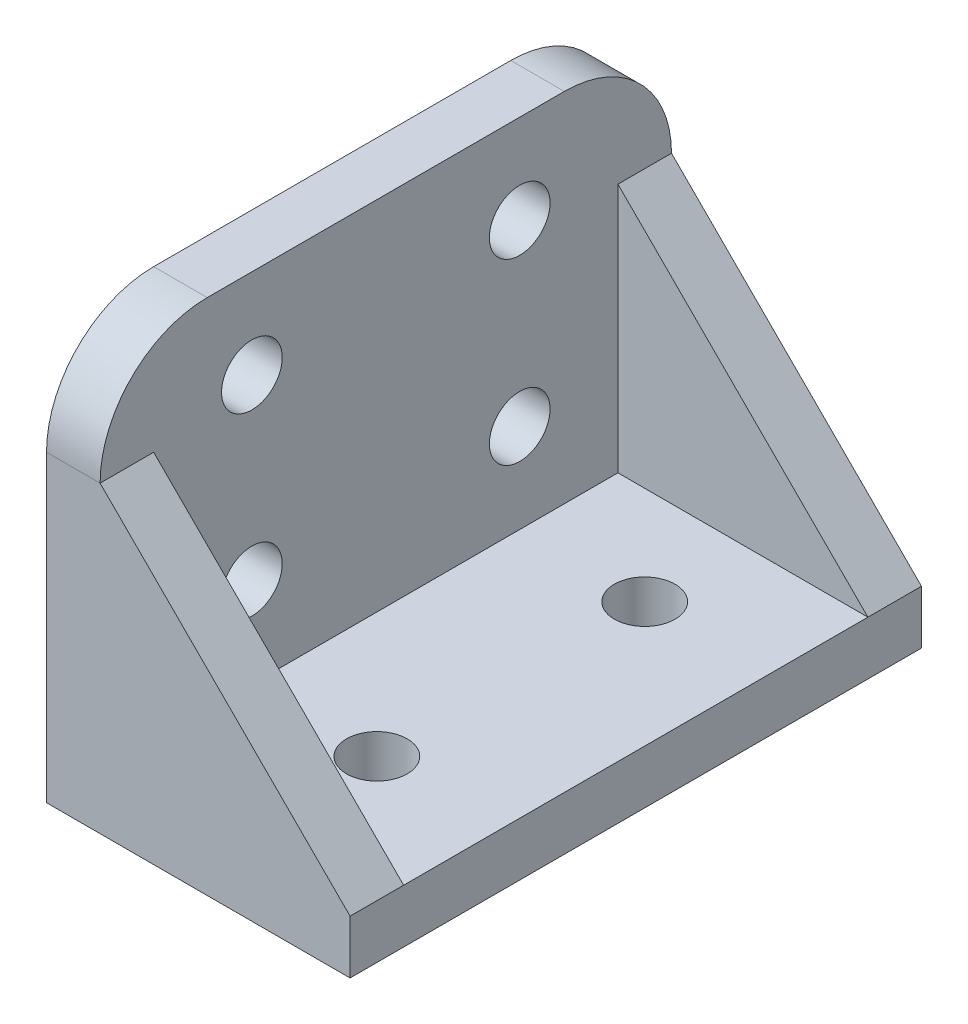
ISO-10303-21;
HEADER;
FILE_DESCRIPTION(('STEP AP214'),'2;1');
FILE_NAME('part.step','',(''),(''),'','','');
FILE_SCHEMA(('AUTOMOTIVE_DESIGN { 1 0 10303 214 1 1 1 1 }'));
ENDSEC;
DATA;
#1=APPLICATION_CONTEXT('core data for automotive mechanical design processes');
#2=APPLICATION_PROTOCOL_DEFINITION('international standard','automotive_design',2000,#1);
#3=PRODUCT_CONTEXT('',#1,'mechanical');
#4=PRODUCT('Part','Part','',(#3));
#5=PRODUCT_RELATED_PRODUCT_CATEGORY('part','',(#4));
#6=PRODUCT_DEFINITION_FORMATION('','',#4);
#7=PRODUCT_DEFINITION_CONTEXT('part definition',#1,'design');
#8=PRODUCT_DEFINITION('design','',#6,#7);
#9=PRODUCT_DEFINITION_SHAPE('','',#8);
#10=(LENGTH_UNIT() NAMED_UNIT(*) SI_UNIT(.MILLI.,.METRE.));
#11=(NAMED_UNIT(*) PLANE_ANGLE_UNIT() SI_UNIT($,.RADIAN.));
#12=(NAMED_UNIT(*) SI_UNIT($,.STERADIAN.) SOLID_ANGLE_UNIT());
#13=UNCERTAINTY_MEASURE_WITH_UNIT(LENGTH_MEASURE(1.E-05),#10,'distance_accuracy_value','');
#14=(GEOMETRIC_REPRESENTATION_CONTEXT(3) GLOBAL_UNCERTAINTY_ASSIGNED_CONTEXT((#13)) GLOBAL_UNIT_ASSIGNED_CONTEXT((#10,
#11,#12)) REPRESENTATION_CONTEXT('',''));
#15=CARTESIAN_POINT('',(0.,0.,0.));
#16=DIRECTION('',(0.,0.,1.));
#17=DIRECTION('',(1.,0.,0.));
#18=AXIS2_PLACEMENT_3D('',#15,#16,#17);
#19=CARTESIAN_POINT('',(14.,0.,32.));
#20=DIRECTION('',(0.,-1.,0.));
#21=DIRECTION('',(1.,0.,0.));
#22=AXIS2_PLACEMENT_3D('',#19,#20,#21);
#23=PLANE('',#22);
#24=CARTESIAN_POINT('',(7.,0.,23.5));
#25=DIRECTION('',(0.,1.,0.));
#26=DIRECTION('',(0.,0.,1.));
#27=AXIS2_PLACEMENT_3D('',#24,#25,#26);
#28=CIRCLE('',#27,1.7);
#29=CARTESIAN_POINT('',(7.,0.,25.2));
#30=VERTEX_POINT('',#29);
#31=EDGE_CURVE('E291',#30,#30,#28,.T.);
#32=ORIENTED_EDGE('',*,*,#31,.F.);
#33=EDGE_LOOP('',(#32));
#34=FACE_BOUND('',#33,.T.);
#35=CARTESIAN_POINT('',(7.,0.,8.5));
#36=DIRECTION('',(0.,1.,0.));
#37=DIRECTION('',(0.,0.,1.));
#38=AXIS2_PLACEMENT_3D('',#35,#36,#37);
#39=CIRCLE('',#38,1.7);
#40=CARTESIAN_POINT('',(7.,0.,10.2));
#41=VERTEX_POINT('',#40);
#42=EDGE_CURVE('E293',#41,#41,#39,.T.);
#43=ORIENTED_EDGE('',*,*,#42,.F.);
#44=EDGE_LOOP('',(#43));
#45=FACE_BOUND('',#44,.T.);
#46=DIRECTION('',(1.,0.,0.));
#47=VECTOR('',#46,1.);
#48=CARTESIAN_POINT('',(0.,0.,29.));
#49=LINE('',#48,#47);
#50=CARTESIAN_POINT('',(0.,0.,29.));
#51=VERTEX_POINT('',#50);
#52=CARTESIAN_POINT('',(14.,0.,29.));
#53=VERTEX_POINT('',#52);
#54=EDGE_CURVE('E117',#51,#53,#49,.T.);
#55=ORIENTED_EDGE('',*,*,#54,.T.);
#56=DIRECTION('',(0.,0.,-1.));
#57=VECTOR('',#56,1.);
#58=CARTESIAN_POINT('',(14.,0.,32.));
#59=LINE('',#58,#57);
#60=CARTESIAN_POINT('',(14.,0.,3.));
#61=VERTEX_POINT('',#60);
#62=EDGE_CURVE('E166',#53,#61,#59,.T.);
#63=ORIENTED_EDGE('',*,*,#62,.T.);
#64=DIRECTION('',(1.,0.,0.));
#65=VECTOR('',#64,1.);
#66=CARTESIAN_POINT('',(0.,0.,3.));
#67=LINE('',#66,#65);
#68=CARTESIAN_POINT('',(0.,0.,3.));
#69=VERTEX_POINT('',#68);
#70=EDGE_CURVE('E146',#69,#61,#67,.T.);
#71=ORIENTED_EDGE('',*,*,#70,.F.);
#72=DIRECTION('',(0.,0.,-1.));
#73=VECTOR('',#72,1.);
#74=CARTESIAN_POINT('',(0.,0.,32.));
#75=LINE('',#74,#73);
#76=EDGE_CURVE('E183',#51,#69,#75,.T.);
#77=ORIENTED_EDGE('',*,*,#76,.F.);
#78=EDGE_LOOP('',(#55,#63,#71,#77));
#79=FACE_BOUND('',#78,.T.);
#80=ADVANCED_FACE('F35',(#34,#45,#79),#23,.F.);
#81=CARTESIAN_POINT('',(0.,0.,32.));
#82=DIRECTION('',(-1.,0.,0.));
#83=DIRECTION('',(0.,0.,1.));
#84=AXIS2_PLACEMENT_3D('',#81,#82,#83);
#85=PLANE('',#84);
#86=CARTESIAN_POINT('',(0.,15.,8.5));
#87=DIRECTION('',(1.,0.,0.));
#88=DIRECTION('',(0.,0.,-1.));
#89=AXIS2_PLACEMENT_3D('',#86,#87,#88);
#90=CIRCLE('',#89,1.7);
#91=CARTESIAN_POINT('',(0.,15.,6.8));
#92=VERTEX_POINT('',#91);
#93=EDGE_CURVE('E301',#92,#92,#90,.T.);
#94=ORIENTED_EDGE('',*,*,#93,.F.);
#95=EDGE_LOOP('',(#94));
#96=FACE_BOUND('',#95,.T.);
#97=CARTESIAN_POINT('',(0.,15.,23.5));
#98=DIRECTION('',(1.,0.,0.));
#99=DIRECTION('',(0.,0.,-1.));
#100=AXIS2_PLACEMENT_3D('',#97,#98,#99);
#101=CIRCLE('',#100,1.7);
#102=CARTESIAN_POINT('',(0.,15.,21.8));
#103=VERTEX_POINT('',#102);
#104=EDGE_CURVE('E307',#103,#103,#101,.T.);
#105=ORIENTED_EDGE('',*,*,#104,.F.);
#106=EDGE_LOOP('',(#105));
#107=FACE_BOUND('',#106,.T.);
#108=CARTESIAN_POINT('',(0.,5.00000000000002,23.5));
#109=DIRECTION('',(1.,0.,0.));
#110=DIRECTION('',(0.,0.,-1.));
#111=AXIS2_PLACEMENT_3D('',#108,#109,#110);
#112=CIRCLE('',#111,1.7);
#113=CARTESIAN_POINT('',(0.,5.00000000000002,21.8));
#114=VERTEX_POINT('',#113);
#115=EDGE_CURVE('E313',#114,#114,#112,.T.);
#116=ORIENTED_EDGE('',*,*,#115,.F.);
#117=EDGE_LOOP('',(#116));
#118=FACE_BOUND('',#117,.T.);
#119=CARTESIAN_POINT('',(0.,5.00000000000002,8.5));
#120=DIRECTION('',(1.,0.,0.));
#121=DIRECTION('',(0.,0.,-1.));
#122=AXIS2_PLACEMENT_3D('',#119,#120,#121);
#123=CIRCLE('',#122,1.7);
#124=CARTESIAN_POINT('',(0.,5.00000000000002,6.8));
#125=VERTEX_POINT('',#124);
#126=EDGE_CURVE('E319',#125,#125,#123,.T.);
#127=ORIENTED_EDGE('',*,*,#126,.F.);
#128=EDGE_LOOP('',(#127));
#129=FACE_BOUND('',#128,.T.);
#130=DIRECTION('',(0.,0.,-1.));
#131=VECTOR('',#130,1.);
#132=CARTESIAN_POINT('',(0.,14.,3.));
#133=LINE('',#132,#131);
#134=CARTESIAN_POINT('',(0.,14.,3.));
#135=VERTEX_POINT('',#134);
#136=CARTESIAN_POINT('',(0.,14.,0.));
#137=VERTEX_POINT('',#136);
#138=EDGE_CURVE('E151',#135,#137,#133,.T.);
#139=ORIENTED_EDGE('',*,*,#138,.T.);
#140=CARTESIAN_POINT('',(0.,14.,6.));
#141=DIRECTION('',(-1.,0.,0.));
#142=DIRECTION('',(0.,0.,1.));
#143=AXIS2_PLACEMENT_3D('',#140,#141,#142);
#144=CIRCLE('',#143,6.);
#145=CARTESIAN_POINT('',(0.,20.,6.));
#146=VERTEX_POINT('',#145);
#147=EDGE_CURVE('E43',#137,#146,#144,.F.);
#148=ORIENTED_EDGE('',*,*,#147,.T.);
#149=DIRECTION('',(0.,0.,-1.));
#150=VECTOR('',#149,1.);
#151=CARTESIAN_POINT('',(0.,20.,32.));
#152=LINE('',#151,#150);
#153=CARTESIAN_POINT('',(0.,20.,26.));
#154=VERTEX_POINT('',#153);
#155=EDGE_CURVE('E180',#154,#146,#152,.T.);
#156=ORIENTED_EDGE('',*,*,#155,.F.);
#157=CARTESIAN_POINT('',(0.,14.,26.));
#158=DIRECTION('',(-1.,0.,0.));
#159=DIRECTION('',(0.,0.,1.));
#160=AXIS2_PLACEMENT_3D('',#157,#158,#159);
#161=CIRCLE('',#160,6.);
#162=CARTESIAN_POINT('',(0.,14.,32.));
#163=VERTEX_POINT('',#162);
#164=EDGE_CURVE('E134',#154,#163,#161,.F.);
#165=ORIENTED_EDGE('',*,*,#164,.T.);
#166=DIRECTION('',(0.,0.,1.));
#167=VECTOR('',#166,1.);
#168=CARTESIAN_POINT('',(0.,14.,29.));
#169=LINE('',#168,#167);
#170=CARTESIAN_POINT('',(0.,14.,29.));
#171=VERTEX_POINT('',#170);
#172=EDGE_CURVE('E125',#171,#163,#169,.T.);
#173=ORIENTED_EDGE('',*,*,#172,.F.);
#174=DIRECTION('',(0.,-1.,0.));
#175=VECTOR('',#174,1.);
#176=CARTESIAN_POINT('',(0.,0.,29.));
#177=LINE('',#176,#175);
#178=EDGE_CURVE('E112',#171,#51,#177,.T.);
#179=ORIENTED_EDGE('',*,*,#178,.T.);
#180=ORIENTED_EDGE('',*,*,#76,.T.);
#181=DIRECTION('',(0.,-1.,0.));
#182=VECTOR('',#181,1.);
#183=CARTESIAN_POINT('',(0.,14.,3.));
#184=LINE('',#183,#182);
#185=EDGE_CURVE('E139',#135,#69,#184,.T.);
#186=ORIENTED_EDGE('',*,*,#185,.F.);
#187=EDGE_LOOP('',(#139,#148,#156,#165,#173,#179,#180,#186));
#188=FACE_BOUND('',#187,.T.);
#189=ADVANCED_FACE('F131',(#96,#107,#118,#129,#188),#85,.F.);
#190=CARTESIAN_POINT('',(0.,20.,32.));
#191=DIRECTION('',(0.,-1.,0.));
#192=DIRECTION('',(1.,0.,0.));
#193=AXIS2_PLACEMENT_3D('',#190,#191,#192);
#194=PLANE('',#193);
#195=ORIENTED_EDGE('',*,*,#155,.T.);
#196=DIRECTION('',(-1.,0.,0.));
#197=VECTOR('',#196,1.);
#198=CARTESIAN_POINT('',(-3.,20.,6.));
#199=LINE('',#198,#197);
#200=CARTESIAN_POINT('',(-3.,20.,6.));
#201=VERTEX_POINT('',#200);
#202=EDGE_CURVE('E187',#146,#201,#199,.T.);
#203=ORIENTED_EDGE('',*,*,#202,.T.);
#204=DIRECTION('',(0.,0.,-1.));
#205=VECTOR('',#204,1.);
#206=CARTESIAN_POINT('',(-3.,20.,32.));
#207=LINE('',#206,#205);
#208=CARTESIAN_POINT('',(-3.,20.,26.));
#209=VERTEX_POINT('',#208);
#210=EDGE_CURVE('E178',#209,#201,#207,.T.);
#211=ORIENTED_EDGE('',*,*,#210,.F.);
#212=DIRECTION('',(-1.,0.,0.));
#213=VECTOR('',#212,1.);
#214=CARTESIAN_POINT('',(0.,20.,26.));
#215=LINE('',#214,#213);
#216=EDGE_CURVE('E185',#209,#154,#215,.F.);
#217=ORIENTED_EDGE('',*,*,#216,.T.);
#218=EDGE_LOOP('',(#195,#203,#211,#217));
#219=FACE_BOUND('',#218,.T.);
#220=ADVANCED_FACE('F200',(#219),#194,.F.);
#221=CARTESIAN_POINT('',(-3.,20.,32.));
#222=DIRECTION('',(1.,0.,0.));
#223=DIRECTION('',(0.,1.,0.));
#224=AXIS2_PLACEMENT_3D('',#221,#222,#223);
#225=PLANE('',#224);
#226=CARTESIAN_POINT('',(-3.,15.,8.5));
#227=DIRECTION('',(1.,0.,0.));
#228=DIRECTION('',(0.,0.,-1.));
#229=AXIS2_PLACEMENT_3D('',#226,#227,#228);
#230=CIRCLE('',#229,1.7);
#231=CARTESIAN_POINT('',(-3.,15.,6.8));
#232=VERTEX_POINT('',#231);
#233=EDGE_CURVE('E304',#232,#232,#230,.T.);
#234=ORIENTED_EDGE('',*,*,#233,.T.);
#235=EDGE_LOOP('',(#234));
#236=FACE_BOUND('',#235,.T.);
#237=CARTESIAN_POINT('',(-3.,15.,23.5));
#238=DIRECTION('',(1.,0.,0.));
#239=DIRECTION('',(0.,0.,-1.));
#240=AXIS2_PLACEMENT_3D('',#237,#238,#239);
#241=CIRCLE('',#240,1.7);
#242=CARTESIAN_POINT('',(-3.,15.,21.8));
#243=VERTEX_POINT('',#242);
#244=EDGE_CURVE('E310',#243,#243,#241,.T.);
#245=ORIENTED_EDGE('',*,*,#244,.T.);
#246=EDGE_LOOP('',(#245));
#247=FACE_BOUND('',#246,.T.);
#248=CARTESIAN_POINT('',(-3.,5.00000000000002,23.5));
#249=DIRECTION('',(1.,0.,0.));
#250=DIRECTION('',(0.,0.,-1.));
#251=AXIS2_PLACEMENT_3D('',#248,#249,#250);
#252=CIRCLE('',#251,1.7);
#253=CARTESIAN_POINT('',(-3.,5.00000000000002,21.8));
#254=VERTEX_POINT('',#253);
#255=EDGE_CURVE('E316',#254,#254,#252,.T.);
#256=ORIENTED_EDGE('',*,*,#255,.T.);
#257=EDGE_LOOP('',(#256));
#258=FACE_BOUND('',#257,.T.);
#259=CARTESIAN_POINT('',(-3.,5.00000000000002,8.5));
#260=DIRECTION('',(1.,0.,0.));
#261=DIRECTION('',(0.,0.,-1.));
#262=AXIS2_PLACEMENT_3D('',#259,#260,#261);
#263=CIRCLE('',#262,1.7);
#264=CARTESIAN_POINT('',(-3.,5.00000000000002,6.8));
#265=VERTEX_POINT('',#264);
#266=EDGE_CURVE('E322',#265,#265,#263,.T.);
#267=ORIENTED_EDGE('',*,*,#266,.T.);
#268=EDGE_LOOP('',(#267));
#269=FACE_BOUND('',#268,.T.);
#270=ORIENTED_EDGE('',*,*,#210,.T.);
#271=CARTESIAN_POINT('',(-3.,14.,6.));
#272=DIRECTION('',(1.,0.,0.));
#273=DIRECTION('',(0.,1.,0.));
#274=AXIS2_PLACEMENT_3D('',#271,#272,#273);
#275=CIRCLE('',#274,6.);
#276=CARTESIAN_POINT('',(-3.,14.,0.));
#277=VERTEX_POINT('',#276);
#278=EDGE_CURVE('E57',#201,#277,#275,.F.);
#279=ORIENTED_EDGE('',*,*,#278,.T.);
#280=DIRECTION('',(0.,-1.,0.));
#281=VECTOR('',#280,1.);
#282=CARTESIAN_POINT('',(-3.,20.,0.));
#283=LINE('',#282,#281);
#284=CARTESIAN_POINT('',(-3.,-3.,0.));
#285=VERTEX_POINT('',#284);
#286=EDGE_CURVE('E157',#277,#285,#283,.T.);
#287=ORIENTED_EDGE('',*,*,#286,.T.);
#288=DIRECTION('',(0.,0.,-1.));
#289=VECTOR('',#288,1.);
#290=CARTESIAN_POINT('',(-3.,-3.,32.));
#291=LINE('',#290,#289);
#292=CARTESIAN_POINT('',(-3.,-3.,32.));
#293=VERTEX_POINT('',#292);
#294=EDGE_CURVE('E175',#293,#285,#291,.T.);
#295=ORIENTED_EDGE('',*,*,#294,.F.);
#296=DIRECTION('',(0.,-1.,0.));
#297=VECTOR('',#296,1.);
#298=CARTESIAN_POINT('',(-3.,20.,32.));
#299=LINE('',#298,#297);
#300=CARTESIAN_POINT('',(-3.,14.,32.));
#301=VERTEX_POINT('',#300);
#302=EDGE_CURVE('E158',#301,#293,#299,.T.);
#303=ORIENTED_EDGE('',*,*,#302,.F.);
#304=CARTESIAN_POINT('',(-3.,14.,26.));
#305=DIRECTION('',(1.,0.,0.));
#306=DIRECTION('',(0.,1.,0.));
#307=AXIS2_PLACEMENT_3D('',#304,#305,#306);
#308=CIRCLE('',#307,6.);
#309=EDGE_CURVE('E50',#301,#209,#308,.F.);
#310=ORIENTED_EDGE('',*,*,#309,.T.);
#311=EDGE_LOOP('',(#270,#279,#287,#295,#303,#310));
#312=FACE_BOUND('',#311,.T.);
#313=ADVANCED_FACE('F209',(#236,#247,#258,#269,#312),#225,.F.);
#314=CARTESIAN_POINT('',(-3.,-3.,32.));
#315=DIRECTION('',(0.,1.,0.));
#316=DIRECTION('',(-1.,0.,0.));
#317=AXIS2_PLACEMENT_3D('',#314,#315,#316);
#318=PLANE('',#317);
#319=CARTESIAN_POINT('',(7.,-3.,23.5));
#320=DIRECTION('',(0.,1.,0.));
#321=DIRECTION('',(0.,0.,1.));
#322=AXIS2_PLACEMENT_3D('',#319,#320,#321);
#323=CIRCLE('',#322,1.7);
#324=CARTESIAN_POINT('',(7.,-3.,25.2));
#325=VERTEX_POINT('',#324);
#326=EDGE_CURVE('E289',#325,#325,#323,.T.);
#327=ORIENTED_EDGE('',*,*,#326,.T.);
#328=EDGE_LOOP('',(#327));
#329=FACE_BOUND('',#328,.T.);
#330=CARTESIAN_POINT('',(7.,-3.,8.5));
#331=DIRECTION('',(0.,1.,0.));
#332=DIRECTION('',(0.,0.,1.));
#333=AXIS2_PLACEMENT_3D('',#330,#331,#332);
#334=CIRCLE('',#333,1.7);
#335=CARTESIAN_POINT('',(7.,-3.,10.2));
#336=VERTEX_POINT('',#335);
#337=EDGE_CURVE('E298',#336,#336,#334,.T.);
#338=ORIENTED_EDGE('',*,*,#337,.T.);
#339=EDGE_LOOP('',(#338));
#340=FACE_BOUND('',#339,.T.);
#341=DIRECTION('',(1.,0.,0.));
#342=VECTOR('',#341,1.);
#343=CARTESIAN_POINT('',(-3.,-3.,0.));
#344=LINE('',#343,#342);
#345=CARTESIAN_POINT('',(14.,-3.,0.));
#346=VERTEX_POINT('',#345);
#347=EDGE_CURVE('E168',#285,#346,#344,.T.);
#348=ORIENTED_EDGE('',*,*,#347,.T.);
#349=DIRECTION('',(0.,0.,-1.));
#350=VECTOR('',#349,1.);
#351=CARTESIAN_POINT('',(14.,-3.,32.));
#352=LINE('',#351,#350);
#353=CARTESIAN_POINT('',(14.,-3.,32.));
#354=VERTEX_POINT('',#353);
#355=EDGE_CURVE('E172',#354,#346,#352,.T.);
#356=ORIENTED_EDGE('',*,*,#355,.F.);
#357=DIRECTION('',(1.,0.,0.));
#358=VECTOR('',#357,1.);
#359=CARTESIAN_POINT('',(-3.,-3.,32.));
#360=LINE('',#359,#358);
#361=EDGE_CURVE('E160',#293,#354,#360,.T.);
#362=ORIENTED_EDGE('',*,*,#361,.F.);
#363=ORIENTED_EDGE('',*,*,#294,.T.);
#364=EDGE_LOOP('',(#348,#356,#362,#363));
#365=FACE_BOUND('',#364,.T.);
#366=ADVANCED_FACE('F213',(#329,#340,#365),#318,.F.);
#367=CARTESIAN_POINT('',(14.,-3.,32.));
#368=DIRECTION('',(-1.,0.,0.));
#369=DIRECTION('',(0.,0.,1.));
#370=AXIS2_PLACEMENT_3D('',#367,#368,#369);
#371=PLANE('',#370);
#372=DIRECTION('',(0.,1.,0.));
#373=VECTOR('',#372,1.);
#374=CARTESIAN_POINT('',(14.,-3.,0.));
#375=LINE('',#374,#373);
#376=CARTESIAN_POINT('',(14.,0.,0.));
#377=VERTEX_POINT('',#376);
#378=EDGE_CURVE('E161',#346,#377,#375,.T.);
#379=ORIENTED_EDGE('',*,*,#378,.T.);
#380=DIRECTION('',(0.,0.,-1.));
#381=VECTOR('',#380,1.);
#382=CARTESIAN_POINT('',(14.,0.,3.));
#383=LINE('',#382,#381);
#384=EDGE_CURVE('E154',#61,#377,#383,.T.);
#385=ORIENTED_EDGE('',*,*,#384,.F.);
#386=ORIENTED_EDGE('',*,*,#62,.F.);
#387=CARTESIAN_POINT('',(14.,0.,32.));
#388=VERTEX_POINT('',#387);
#389=EDGE_CURVE('E127',#388,#53,#59,.T.);
#390=ORIENTED_EDGE('',*,*,#389,.F.);
#391=DIRECTION('',(0.,1.,0.));
#392=VECTOR('',#391,1.);
#393=CARTESIAN_POINT('',(14.,-3.,32.));
#394=LINE('',#393,#392);
#395=EDGE_CURVE('E163',#354,#388,#394,.T.);
#396=ORIENTED_EDGE('',*,*,#395,.F.);
#397=ORIENTED_EDGE('',*,*,#355,.T.);
#398=EDGE_LOOP('',(#379,#385,#386,#390,#396,#397));
#399=FACE_BOUND('',#398,.T.);
#400=ADVANCED_FACE('F241',(#399),#371,.F.);
#401=CARTESIAN_POINT('',(0.,0.,32.));
#402=DIRECTION('',(0.,0.,-1.));
#403=DIRECTION('',(-1.,0.,0.));
#404=AXIS2_PLACEMENT_3D('',#401,#402,#403);
#405=PLANE('',#404);
#406=DIRECTION('',(-0.707106781186548,0.707106781186548,0.));
#407=VECTOR('',#406,1.);
#408=CARTESIAN_POINT('',(7.,7.,32.));
#409=LINE('',#408,#407);
#410=EDGE_CURVE('E128',#388,#163,#409,.T.);
#411=ORIENTED_EDGE('',*,*,#410,.T.);
#412=DIRECTION('',(-1.,0.,0.));
#413=VECTOR('',#412,1.);
#414=CARTESIAN_POINT('',(0.,14.,32.));
#415=LINE('',#414,#413);
#416=EDGE_CURVE('E11',#163,#301,#415,.T.);
#417=ORIENTED_EDGE('',*,*,#416,.T.);
#418=ORIENTED_EDGE('',*,*,#302,.T.);
#419=ORIENTED_EDGE('',*,*,#361,.T.);
#420=ORIENTED_EDGE('',*,*,#395,.T.);
#421=EDGE_LOOP('',(#411,#417,#418,#419,#420));
#422=FACE_BOUND('',#421,.T.);
#423=ADVANCED_FACE('F217',(#422),#405,.F.);
#424=CARTESIAN_POINT('',(0.,0.,0.));
#425=DIRECTION('',(0.,0.,-1.));
#426=DIRECTION('',(-1.,0.,0.));
#427=AXIS2_PLACEMENT_3D('',#424,#425,#426);
#428=PLANE('',#427);
#429=ORIENTED_EDGE('',*,*,#286,.F.);
#430=DIRECTION('',(-1.,0.,0.));
#431=VECTOR('',#430,1.);
#432=CARTESIAN_POINT('',(0.,14.,0.));
#433=LINE('',#432,#431);
#434=EDGE_CURVE('E192',#277,#137,#433,.F.);
#435=ORIENTED_EDGE('',*,*,#434,.T.);
#436=DIRECTION('',(-0.707106781186547,0.707106781186547,0.));
#437=VECTOR('',#436,1.);
#438=CARTESIAN_POINT('',(14.,0.,0.));
#439=LINE('',#438,#437);
#440=EDGE_CURVE('E136',#377,#137,#439,.T.);
#441=ORIENTED_EDGE('',*,*,#440,.F.);
#442=ORIENTED_EDGE('',*,*,#378,.F.);
#443=ORIENTED_EDGE('',*,*,#347,.F.);
#444=EDGE_LOOP('',(#429,#435,#441,#442,#443));
#445=FACE_BOUND('',#444,.T.);
#446=ADVANCED_FACE('F205',(#445),#428,.T.);
#447=CARTESIAN_POINT('',(14.,0.,3.));
#448=DIRECTION('',(-0.707106781186548,-0.707106781186548,0.));
#449=DIRECTION('',(0.707106781186548,-0.707106781186548,0.));
#450=AXIS2_PLACEMENT_3D('',#447,#448,#449);
#451=PLANE('',#450);
#452=ORIENTED_EDGE('',*,*,#440,.T.);
#453=ORIENTED_EDGE('',*,*,#138,.F.);
#454=DIRECTION('',(-0.707106781186547,0.707106781186547,0.));
#455=VECTOR('',#454,1.);
#456=CARTESIAN_POINT('',(14.,0.,3.));
#457=LINE('',#456,#455);
#458=EDGE_CURVE('E149',#61,#135,#457,.T.);
#459=ORIENTED_EDGE('',*,*,#458,.F.);
#460=ORIENTED_EDGE('',*,*,#384,.T.);
#461=EDGE_LOOP('',(#452,#453,#459,#460));
#462=FACE_BOUND('',#461,.T.);
#463=ADVANCED_FACE('F248',(#462),#451,.F.);
#464=CARTESIAN_POINT('',(0.,0.,3.));
#465=DIRECTION('',(0.,0.,1.));
#466=DIRECTION('',(1.,0.,0.));
#467=AXIS2_PLACEMENT_3D('',#464,#465,#466);
#468=PLANE('',#467);
#469=ORIENTED_EDGE('',*,*,#185,.T.);
#470=ORIENTED_EDGE('',*,*,#70,.T.);
#471=ORIENTED_EDGE('',*,*,#458,.T.);
#472=EDGE_LOOP('',(#469,#470,#471));
#473=FACE_BOUND('',#472,.T.);
#474=ADVANCED_FACE('F253',(#473),#468,.T.);
#475=CARTESIAN_POINT('',(7.,7.,29.));
#476=DIRECTION('',(0.707106781186547,0.707106781186547,0.));
#477=DIRECTION('',(-0.707106781186548,0.707106781186548,0.));
#478=AXIS2_PLACEMENT_3D('',#475,#476,#477);
#479=PLANE('',#478);
#480=ORIENTED_EDGE('',*,*,#410,.F.);
#481=ORIENTED_EDGE('',*,*,#389,.T.);
#482=DIRECTION('',(-0.707106781186548,0.707106781186548,0.));
#483=VECTOR('',#482,1.);
#484=CARTESIAN_POINT('',(7.,7.,29.));
#485=LINE('',#484,#483);
#486=EDGE_CURVE('E115',#53,#171,#485,.T.);
#487=ORIENTED_EDGE('',*,*,#486,.T.);
#488=ORIENTED_EDGE('',*,*,#172,.T.);
#489=EDGE_LOOP('',(#480,#481,#487,#488));
#490=FACE_BOUND('',#489,.T.);
#491=ADVANCED_FACE('F124',(#490),#479,.T.);
#492=CARTESIAN_POINT('',(0.,0.,29.));
#493=DIRECTION('',(0.,0.,1.));
#494=DIRECTION('',(1.,0.,0.));
#495=AXIS2_PLACEMENT_3D('',#492,#493,#494);
#496=PLANE('',#495);
#497=ORIENTED_EDGE('',*,*,#486,.F.);
#498=ORIENTED_EDGE('',*,*,#54,.F.);
#499=ORIENTED_EDGE('',*,*,#178,.F.);
#500=EDGE_LOOP('',(#497,#498,#499));
#501=FACE_BOUND('',#500,.T.);
#502=ADVANCED_FACE('F114',(#501),#496,.F.);
#503=CARTESIAN_POINT('',(0.,5.00000000000002,8.5));
#504=DIRECTION('',(1.,0.,0.));
#505=DIRECTION('',(0.,0.,-1.));
#506=AXIS2_PLACEMENT_3D('',#503,#504,#505);
#507=CYLINDRICAL_SURFACE('',#506,1.7);
#508=ORIENTED_EDGE('',*,*,#266,.F.);
#509=EDGE_LOOP('',(#508));
#510=FACE_BOUND('',#509,.T.);
#511=ORIENTED_EDGE('',*,*,#126,.T.);
#512=EDGE_LOOP('',(#511));
#513=FACE_BOUND('',#512,.T.);
#514=ADVANCED_FACE('F262',(#510,#513),#507,.F.);
#515=CARTESIAN_POINT('',(0.,5.00000000000002,23.5));
#516=DIRECTION('',(1.,0.,0.));
#517=DIRECTION('',(0.,0.,-1.));
#518=AXIS2_PLACEMENT_3D('',#515,#516,#517);
#519=CYLINDRICAL_SURFACE('',#518,1.7);
#520=ORIENTED_EDGE('',*,*,#255,.F.);
#521=EDGE_LOOP('',(#520));
#522=FACE_BOUND('',#521,.T.);
#523=ORIENTED_EDGE('',*,*,#115,.T.);
#524=EDGE_LOOP('',(#523));
#525=FACE_BOUND('',#524,.T.);
#526=ADVANCED_FACE('F265',(#522,#525),#519,.F.);
#527=CARTESIAN_POINT('',(0.,15.,23.5));
#528=DIRECTION('',(1.,0.,0.));
#529=DIRECTION('',(0.,0.,-1.));
#530=AXIS2_PLACEMENT_3D('',#527,#528,#529);
#531=CYLINDRICAL_SURFACE('',#530,1.7);
#532=ORIENTED_EDGE('',*,*,#244,.F.);
#533=EDGE_LOOP('',(#532));
#534=FACE_BOUND('',#533,.T.);
#535=ORIENTED_EDGE('',*,*,#104,.T.);
#536=EDGE_LOOP('',(#535));
#537=FACE_BOUND('',#536,.T.);
#538=ADVANCED_FACE('F269',(#534,#537),#531,.F.);
#539=CARTESIAN_POINT('',(0.,15.,8.5));
#540=DIRECTION('',(1.,0.,0.));
#541=DIRECTION('',(0.,0.,-1.));
#542=AXIS2_PLACEMENT_3D('',#539,#540,#541);
#543=CYLINDRICAL_SURFACE('',#542,1.7);
#544=ORIENTED_EDGE('',*,*,#233,.F.);
#545=EDGE_LOOP('',(#544));
#546=FACE_BOUND('',#545,.T.);
#547=ORIENTED_EDGE('',*,*,#93,.T.);
#548=EDGE_LOOP('',(#547));
#549=FACE_BOUND('',#548,.T.);
#550=ADVANCED_FACE('F273',(#546,#549),#543,.F.);
#551=CARTESIAN_POINT('',(7.,0.,8.5));
#552=DIRECTION('',(0.,1.,0.));
#553=DIRECTION('',(0.,0.,1.));
#554=AXIS2_PLACEMENT_3D('',#551,#552,#553);
#555=CYLINDRICAL_SURFACE('',#554,1.7);
#556=ORIENTED_EDGE('',*,*,#337,.F.);
#557=EDGE_LOOP('',(#556));
#558=FACE_BOUND('',#557,.T.);
#559=ORIENTED_EDGE('',*,*,#42,.T.);
#560=EDGE_LOOP('',(#559));
#561=FACE_BOUND('',#560,.T.);
#562=ADVANCED_FACE('F277',(#558,#561),#555,.F.);
#563=CARTESIAN_POINT('',(7.,0.,23.5));
#564=DIRECTION('',(0.,1.,0.));
#565=DIRECTION('',(0.,0.,1.));
#566=AXIS2_PLACEMENT_3D('',#563,#564,#565);
#567=CYLINDRICAL_SURFACE('',#566,1.7);
#568=ORIENTED_EDGE('',*,*,#326,.F.);
#569=EDGE_LOOP('',(#568));
#570=FACE_BOUND('',#569,.T.);
#571=ORIENTED_EDGE('',*,*,#31,.T.);
#572=EDGE_LOOP('',(#571));
#573=FACE_BOUND('',#572,.T.);
#574=ADVANCED_FACE('F222',(#570,#573),#567,.F.);
#575=CARTESIAN_POINT('',(0.,14.,6.));
#576=DIRECTION('',(1.,0.,0.));
#577=DIRECTION('',(0.,1.,0.));
#578=AXIS2_PLACEMENT_3D('',#575,#576,#577);
#579=CYLINDRICAL_SURFACE('',#578,6.);
#580=ORIENTED_EDGE('',*,*,#147,.F.);
#581=ORIENTED_EDGE('',*,*,#434,.F.);
#582=ORIENTED_EDGE('',*,*,#278,.F.);
#583=ORIENTED_EDGE('',*,*,#202,.F.);
#584=EDGE_LOOP('',(#580,#581,#582,#583));
#585=FACE_BOUND('',#584,.T.);
#586=ADVANCED_FACE('F202',(#585),#579,.T.);
#587=CARTESIAN_POINT('',(0.,14.,26.));
#588=DIRECTION('',(-1.,0.,0.));
#589=DIRECTION('',(0.,-1.,0.));
#590=AXIS2_PLACEMENT_3D('',#587,#588,#589);
#591=CYLINDRICAL_SURFACE('',#590,6.);
#592=ORIENTED_EDGE('',*,*,#164,.F.);
#593=ORIENTED_EDGE('',*,*,#216,.F.);
#594=ORIENTED_EDGE('',*,*,#309,.F.);
#595=ORIENTED_EDGE('',*,*,#416,.F.);
#596=EDGE_LOOP('',(#592,#593,#594,#595));
#597=FACE_BOUND('',#596,.T.);
#598=ADVANCED_FACE('F37',(#597),#591,.T.);
#599=CLOSED_SHELL('',(#80,#189,#220,#313,#366,#400,#423,#446,#463,#474,#491,#502,#514,#526,#538,
#550,#562,#574,#586,#598));
#600=MANIFOLD_SOLID_BREP('B2',#599);
#601=ADVANCED_BREP_SHAPE_REPRESENTATION('',(#18,#600),#14);
#602=SHAPE_DEFINITION_REPRESENTATION(#9,#601);
ENDSEC;
END-ISO-10303-21;
